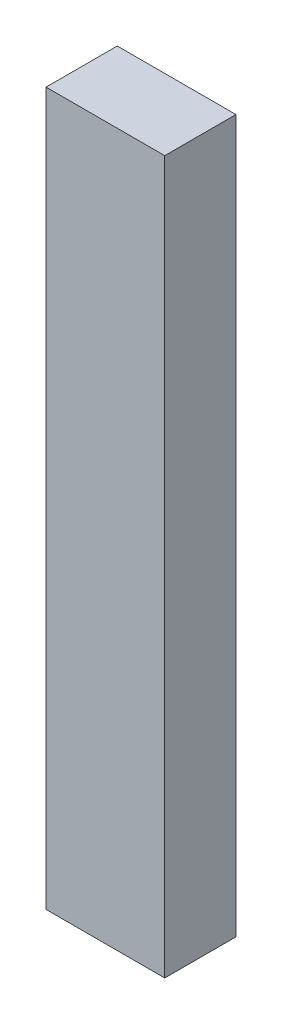
ISO-10303-21;
HEADER;
FILE_DESCRIPTION(('STEP AP214'),'2;1');
FILE_NAME('part.step','',(''),(''),'','','');
FILE_SCHEMA(('AUTOMOTIVE_DESIGN { 1 0 10303 214 1 1 1 1 }'));
ENDSEC;
DATA;
#1=APPLICATION_CONTEXT('core data for automotive mechanical design processes');
#2=APPLICATION_PROTOCOL_DEFINITION('international standard','automotive_design',2000,#1);
#3=PRODUCT_CONTEXT('',#1,'mechanical');
#4=PRODUCT('Part','Part','',(#3));
#5=PRODUCT_RELATED_PRODUCT_CATEGORY('part','',(#4));
#6=PRODUCT_DEFINITION_FORMATION('','',#4);
#7=PRODUCT_DEFINITION_CONTEXT('part definition',#1,'design');
#8=PRODUCT_DEFINITION('design','',#6,#7);
#9=PRODUCT_DEFINITION_SHAPE('','',#8);
#10=(LENGTH_UNIT() NAMED_UNIT(*) SI_UNIT(.MILLI.,.METRE.));
#11=(NAMED_UNIT(*) PLANE_ANGLE_UNIT() SI_UNIT($,.RADIAN.));
#12=(NAMED_UNIT(*) SI_UNIT($,.STERADIAN.) SOLID_ANGLE_UNIT());
#13=UNCERTAINTY_MEASURE_WITH_UNIT(LENGTH_MEASURE(1.E-05),#10,'distance_accuracy_value','');
#14=(GEOMETRIC_REPRESENTATION_CONTEXT(3) GLOBAL_UNCERTAINTY_ASSIGNED_CONTEXT((#13)) GLOBAL_UNIT_ASSIGNED_CONTEXT((#10,
#11,#12)) REPRESENTATION_CONTEXT('',''));
#15=CARTESIAN_POINT('',(0.,0.,0.));
#16=DIRECTION('',(0.,0.,1.));
#17=DIRECTION('',(1.,0.,0.));
#18=AXIS2_PLACEMENT_3D('',#15,#16,#17);
#19=CARTESIAN_POINT('',(5.,15.,3.));
#20=DIRECTION('',(1.,0.,0.));
#21=DIRECTION('',(0.,1.,0.));
#22=AXIS2_PLACEMENT_3D('',#19,#20,#21);
#23=PLANE('',#22);
#24=DIRECTION('',(0.,-1.,0.));
#25=VECTOR('',#24,1.);
#26=CARTESIAN_POINT('',(5.,15.,0.));
#27=LINE('',#26,#25);
#28=CARTESIAN_POINT('',(5.,15.,0.));
#29=VERTEX_POINT('',#28);
#30=CARTESIAN_POINT('',(5.,-15.,0.));
#31=VERTEX_POINT('',#30);
#32=EDGE_CURVE('E95',#29,#31,#27,.T.);
#33=ORIENTED_EDGE('',*,*,#32,.T.);
#34=DIRECTION('',(0.,0.,-1.));
#35=VECTOR('',#34,1.);
#36=CARTESIAN_POINT('',(5.,-15.,3.));
#37=LINE('',#36,#35);
#38=CARTESIAN_POINT('',(5.,-15.,3.));
#39=VERTEX_POINT('',#38);
#40=EDGE_CURVE('E11',#39,#31,#37,.T.);
#41=ORIENTED_EDGE('',*,*,#40,.F.);
#42=DIRECTION('',(0.,-1.,0.));
#43=VECTOR('',#42,1.);
#44=CARTESIAN_POINT('',(5.,15.,3.));
#45=LINE('',#44,#43);
#46=CARTESIAN_POINT('',(5.,15.,3.));
#47=VERTEX_POINT('',#46);
#48=EDGE_CURVE('E83',#47,#39,#45,.T.);
#49=ORIENTED_EDGE('',*,*,#48,.F.);
#50=DIRECTION('',(0.,0.,-1.));
#51=VECTOR('',#50,1.);
#52=CARTESIAN_POINT('',(5.,15.,3.));
#53=LINE('',#52,#51);
#54=EDGE_CURVE('E91',#47,#29,#53,.T.);
#55=ORIENTED_EDGE('',*,*,#54,.T.);
#56=EDGE_LOOP('',(#33,#41,#49,#55));
#57=FACE_BOUND('',#56,.T.);
#58=ADVANCED_FACE('F32',(#57),#23,.F.);
#59=CARTESIAN_POINT('',(5.,-15.,3.));
#60=DIRECTION('',(0.,1.,0.));
#61=DIRECTION('',(0.,0.,1.));
#62=AXIS2_PLACEMENT_3D('',#59,#60,#61);
#63=PLANE('',#62);
#64=DIRECTION('',(1.,0.,0.));
#65=VECTOR('',#64,1.);
#66=CARTESIAN_POINT('',(5.,-15.,0.));
#67=LINE('',#66,#65);
#68=CARTESIAN_POINT('',(10.,-15.,0.));
#69=VERTEX_POINT('',#68);
#70=EDGE_CURVE('E87',#31,#69,#67,.T.);
#71=ORIENTED_EDGE('',*,*,#70,.T.);
#72=DIRECTION('',(0.,0.,-1.));
#73=VECTOR('',#72,1.);
#74=CARTESIAN_POINT('',(10.,-15.,3.));
#75=LINE('',#74,#73);
#76=CARTESIAN_POINT('',(10.,-15.,3.));
#77=VERTEX_POINT('',#76);
#78=EDGE_CURVE('E40',#77,#69,#75,.T.);
#79=ORIENTED_EDGE('',*,*,#78,.F.);
#80=DIRECTION('',(1.,0.,0.));
#81=VECTOR('',#80,1.);
#82=CARTESIAN_POINT('',(5.,-15.,3.));
#83=LINE('',#82,#81);
#84=EDGE_CURVE('E78',#39,#77,#83,.T.);
#85=ORIENTED_EDGE('',*,*,#84,.F.);
#86=ORIENTED_EDGE('',*,*,#40,.T.);
#87=EDGE_LOOP('',(#71,#79,#85,#86));
#88=FACE_BOUND('',#87,.T.);
#89=ADVANCED_FACE('F86',(#88),#63,.F.);
#90=CARTESIAN_POINT('',(10.,15.,3.));
#91=DIRECTION('',(-1.,0.,0.));
#92=DIRECTION('',(0.,-1.,0.));
#93=AXIS2_PLACEMENT_3D('',#90,#91,#92);
#94=PLANE('',#93);
#95=DIRECTION('',(0.,1.,0.));
#96=VECTOR('',#95,1.);
#97=CARTESIAN_POINT('',(10.,15.,0.));
#98=LINE('',#97,#96);
#99=CARTESIAN_POINT('',(10.,15.,0.));
#100=VERTEX_POINT('',#99);
#101=EDGE_CURVE('E65',#69,#100,#98,.T.);
#102=ORIENTED_EDGE('',*,*,#101,.T.);
#103=DIRECTION('',(0.,0.,-1.));
#104=VECTOR('',#103,1.);
#105=CARTESIAN_POINT('',(10.,15.,3.));
#106=LINE('',#105,#104);
#107=CARTESIAN_POINT('',(10.,15.,3.));
#108=VERTEX_POINT('',#107);
#109=EDGE_CURVE('E88',#108,#100,#106,.T.);
#110=ORIENTED_EDGE('',*,*,#109,.F.);
#111=DIRECTION('',(0.,1.,0.));
#112=VECTOR('',#111,1.);
#113=CARTESIAN_POINT('',(10.,15.,3.));
#114=LINE('',#113,#112);
#115=EDGE_CURVE('E81',#77,#108,#114,.T.);
#116=ORIENTED_EDGE('',*,*,#115,.F.);
#117=ORIENTED_EDGE('',*,*,#78,.T.);
#118=EDGE_LOOP('',(#102,#110,#116,#117));
#119=FACE_BOUND('',#118,.T.);
#120=ADVANCED_FACE('F89',(#119),#94,.F.);
#121=CARTESIAN_POINT('',(5.,15.,3.));
#122=DIRECTION('',(0.,-1.,0.));
#123=DIRECTION('',(0.,0.,-1.));
#124=AXIS2_PLACEMENT_3D('',#121,#122,#123);
#125=PLANE('',#124);
#126=DIRECTION('',(-1.,0.,0.));
#127=VECTOR('',#126,1.);
#128=CARTESIAN_POINT('',(5.,15.,0.));
#129=LINE('',#128,#127);
#130=EDGE_CURVE('E71',#100,#29,#129,.T.);
#131=ORIENTED_EDGE('',*,*,#130,.T.);
#132=ORIENTED_EDGE('',*,*,#54,.F.);
#133=DIRECTION('',(-1.,0.,0.));
#134=VECTOR('',#133,1.);
#135=CARTESIAN_POINT('',(5.,15.,3.));
#136=LINE('',#135,#134);
#137=EDGE_CURVE('E48',#108,#47,#136,.T.);
#138=ORIENTED_EDGE('',*,*,#137,.F.);
#139=ORIENTED_EDGE('',*,*,#109,.T.);
#140=EDGE_LOOP('',(#131,#132,#138,#139));
#141=FACE_BOUND('',#140,.T.);
#142=ADVANCED_FACE('F102',(#141),#125,.F.);
#143=CARTESIAN_POINT('',(0.,0.,3.));
#144=DIRECTION('',(0.,0.,1.));
#145=DIRECTION('',(1.,0.,0.));
#146=AXIS2_PLACEMENT_3D('',#143,#144,#145);
#147=PLANE('',#146);
#148=ORIENTED_EDGE('',*,*,#48,.T.);
#149=ORIENTED_EDGE('',*,*,#84,.T.);
#150=ORIENTED_EDGE('',*,*,#115,.T.);
#151=ORIENTED_EDGE('',*,*,#137,.T.);
#152=EDGE_LOOP('',(#148,#149,#150,#151));
#153=FACE_BOUND('',#152,.T.);
#154=ADVANCED_FACE('F79',(#153),#147,.T.);
#155=CARTESIAN_POINT('',(0.,0.,0.));
#156=DIRECTION('',(0.,0.,1.));
#157=DIRECTION('',(1.,0.,0.));
#158=AXIS2_PLACEMENT_3D('',#155,#156,#157);
#159=PLANE('',#158);
#160=ORIENTED_EDGE('',*,*,#32,.F.);
#161=ORIENTED_EDGE('',*,*,#130,.F.);
#162=ORIENTED_EDGE('',*,*,#101,.F.);
#163=ORIENTED_EDGE('',*,*,#70,.F.);
#164=EDGE_LOOP('',(#160,#161,#162,#163));
#165=FACE_BOUND('',#164,.T.);
#166=ADVANCED_FACE('F105',(#165),#159,.F.);
#167=CLOSED_SHELL('',(#58,#89,#120,#142,#154,#166));
#168=MANIFOLD_SOLID_BREP('B2',#167);
#169=ADVANCED_BREP_SHAPE_REPRESENTATION('',(#18,#168),#14);
#170=SHAPE_DEFINITION_REPRESENTATION(#9,#169);
ENDSEC;
END-ISO-10303-21;
